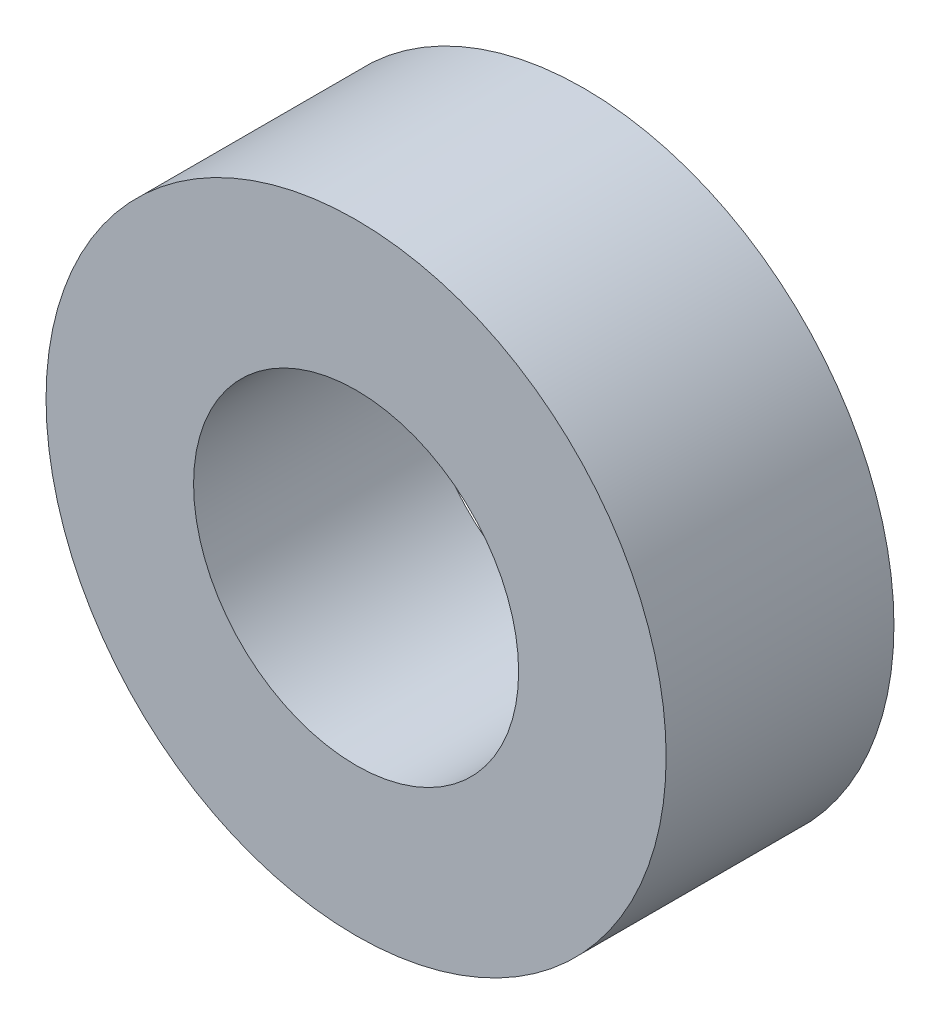
ISO-10303-21;
HEADER;
FILE_DESCRIPTION(('STEP AP214'),'2;1');
FILE_NAME('part.step','',(''),(''),'','','');
FILE_SCHEMA(('AUTOMOTIVE_DESIGN { 1 0 10303 214 1 1 1 1 }'));
ENDSEC;
DATA;
#1=APPLICATION_CONTEXT('core data for automotive mechanical design processes');
#2=APPLICATION_PROTOCOL_DEFINITION('international standard','automotive_design',2000,#1);
#3=PRODUCT_CONTEXT('',#1,'mechanical');
#4=PRODUCT('Part','Part','',(#3));
#5=PRODUCT_RELATED_PRODUCT_CATEGORY('part','',(#4));
#6=PRODUCT_DEFINITION_FORMATION('','',#4);
#7=PRODUCT_DEFINITION_CONTEXT('part definition',#1,'design');
#8=PRODUCT_DEFINITION('design','',#6,#7);
#9=PRODUCT_DEFINITION_SHAPE('','',#8);
#10=(LENGTH_UNIT() NAMED_UNIT(*) SI_UNIT(.MILLI.,.METRE.));
#11=(NAMED_UNIT(*) PLANE_ANGLE_UNIT() SI_UNIT($,.RADIAN.));
#12=(NAMED_UNIT(*) SI_UNIT($,.STERADIAN.) SOLID_ANGLE_UNIT());
#13=UNCERTAINTY_MEASURE_WITH_UNIT(LENGTH_MEASURE(1.E-05),#10,'distance_accuracy_value','');
#14=(GEOMETRIC_REPRESENTATION_CONTEXT(3) GLOBAL_UNCERTAINTY_ASSIGNED_CONTEXT((#13)) GLOBAL_UNIT_ASSIGNED_CONTEXT((#10,
#11,#12)) REPRESENTATION_CONTEXT('',''));
#15=CARTESIAN_POINT('',(0.,0.,0.));
#16=DIRECTION('',(0.,0.,1.));
#17=DIRECTION('',(1.,0.,0.));
#18=AXIS2_PLACEMENT_3D('',#15,#16,#17);
#19=CARTESIAN_POINT('',(0.,0.,11.1252));
#20=DIRECTION('',(0.,0.,-1.));
#21=DIRECTION('',(-1.,0.,0.));
#22=AXIS2_PLACEMENT_3D('',#19,#20,#21);
#23=CYLINDRICAL_SURFACE('',#22,15.142307663);
#24=CARTESIAN_POINT('',(0.,0.,11.1252));
#25=DIRECTION('',(0.,0.,1.));
#26=DIRECTION('',(1.,0.,0.));
#27=AXIS2_PLACEMENT_3D('',#24,#25,#26);
#28=CIRCLE('',#27,15.142307663);
#29=CARTESIAN_POINT('',(-15.142307663,0.,11.1252));
#30=VERTEX_POINT('',#29);
#31=EDGE_CURVE('E10',#30,#30,#28,.T.);
#32=CARTESIAN_POINT('',(0.,0.,0.));
#33=DIRECTION('',(0.,0.,1.));
#34=DIRECTION('',(1.,0.,0.));
#35=AXIS2_PLACEMENT_3D('',#32,#33,#34);
#36=CIRCLE('',#35,15.142307663);
#37=CARTESIAN_POINT('',(-15.142307663,0.,0.));
#38=VERTEX_POINT('',#37);
#39=EDGE_CURVE('E42',#38,#38,#36,.T.);
#40=CARTESIAN_POINT('',(-15.142307663,0.,11.1252));
#41=CARTESIAN_POINT('',(-15.142307663,0.,11.0093125));
#42=CARTESIAN_POINT('',(-15.142307663,0.,10.893425));
#43=CARTESIAN_POINT('',(-15.142307663,0.,10.66165));
#44=CARTESIAN_POINT('',(-15.142307663,0.,10.5457625));
#45=CARTESIAN_POINT('',(-15.142307663,0.,10.3139875));
#46=CARTESIAN_POINT('',(-15.142307663,0.,10.1981));
#47=CARTESIAN_POINT('',(-15.142307663,0.,9.966325));
#48=CARTESIAN_POINT('',(-15.142307663,0.,9.8504375));
#49=CARTESIAN_POINT('',(-15.142307663,0.,9.6186625));
#50=CARTESIAN_POINT('',(-15.142307663,0.,9.502775));
#51=CARTESIAN_POINT('',(-15.142307663,0.,9.271));
#52=CARTESIAN_POINT('',(-15.142307663,0.,9.1551125));
#53=CARTESIAN_POINT('',(-15.142307663,0.,8.9233375));
#54=CARTESIAN_POINT('',(-15.142307663,0.,8.80745));
#55=CARTESIAN_POINT('',(-15.142307663,0.,8.575675));
#56=CARTESIAN_POINT('',(-15.142307663,0.,8.4597875));
#57=CARTESIAN_POINT('',(-15.142307663,0.,8.2280125));
#58=CARTESIAN_POINT('',(-15.142307663,0.,8.112125));
#59=CARTESIAN_POINT('',(-15.142307663,0.,7.88035));
#60=CARTESIAN_POINT('',(-15.142307663,0.,7.7644625));
#61=CARTESIAN_POINT('',(-15.142307663,0.,7.5326875));
#62=CARTESIAN_POINT('',(-15.142307663,0.,7.4168));
#63=CARTESIAN_POINT('',(-15.142307663,0.,7.185025));
#64=CARTESIAN_POINT('',(-15.142307663,0.,7.0691375));
#65=CARTESIAN_POINT('',(-15.142307663,0.,6.8373625));
#66=CARTESIAN_POINT('',(-15.142307663,0.,6.721475));
#67=CARTESIAN_POINT('',(-15.142307663,0.,6.4897));
#68=CARTESIAN_POINT('',(-15.142307663,0.,6.3738125));
#69=CARTESIAN_POINT('',(-15.142307663,0.,6.1420375));
#70=CARTESIAN_POINT('',(-15.142307663,0.,6.02615));
#71=CARTESIAN_POINT('',(-15.142307663,0.,5.794375));
#72=CARTESIAN_POINT('',(-15.142307663,0.,5.6784875));
#73=CARTESIAN_POINT('',(-15.142307663,0.,5.4467125));
#74=CARTESIAN_POINT('',(-15.142307663,0.,5.330825));
#75=CARTESIAN_POINT('',(-15.142307663,0.,5.09905));
#76=CARTESIAN_POINT('',(-15.142307663,0.,4.9831625));
#77=CARTESIAN_POINT('',(-15.142307663,0.,4.7513875));
#78=CARTESIAN_POINT('',(-15.142307663,0.,4.6355));
#79=CARTESIAN_POINT('',(-15.142307663,0.,4.403725));
#80=CARTESIAN_POINT('',(-15.142307663,0.,4.2878375));
#81=CARTESIAN_POINT('',(-15.142307663,0.,4.0560625));
#82=CARTESIAN_POINT('',(-15.142307663,0.,3.940175));
#83=CARTESIAN_POINT('',(-15.142307663,0.,3.7084));
#84=CARTESIAN_POINT('',(-15.142307663,0.,3.5925125));
#85=CARTESIAN_POINT('',(-15.142307663,0.,3.3607375));
#86=CARTESIAN_POINT('',(-15.142307663,0.,3.24485));
#87=CARTESIAN_POINT('',(-15.142307663,0.,3.013075));
#88=CARTESIAN_POINT('',(-15.142307663,0.,2.8971875));
#89=CARTESIAN_POINT('',(-15.142307663,0.,2.6654125));
#90=CARTESIAN_POINT('',(-15.142307663,0.,2.549525));
#91=CARTESIAN_POINT('',(-15.142307663,0.,2.31775));
#92=CARTESIAN_POINT('',(-15.142307663,0.,2.2018625));
#93=CARTESIAN_POINT('',(-15.142307663,0.,1.9700875));
#94=CARTESIAN_POINT('',(-15.142307663,0.,1.8542));
#95=CARTESIAN_POINT('',(-15.142307663,0.,1.622425));
#96=CARTESIAN_POINT('',(-15.142307663,0.,1.5065375));
#97=CARTESIAN_POINT('',(-15.142307663,0.,1.2747625));
#98=CARTESIAN_POINT('',(-15.142307663,0.,1.158875));
#99=CARTESIAN_POINT('',(-15.142307663,0.,0.9271));
#100=CARTESIAN_POINT('',(-15.142307663,0.,0.8112125));
#101=CARTESIAN_POINT('',(-15.142307663,0.,0.5794375));
#102=CARTESIAN_POINT('',(-15.142307663,0.,0.46355));
#103=CARTESIAN_POINT('',(-15.142307663,0.,0.231775));
#104=CARTESIAN_POINT('',(-15.142307663,0.,0.1158875));
#105=CARTESIAN_POINT('',(-15.142307663,0.,0.));
#106=B_SPLINE_CURVE_WITH_KNOTS('',3,(#40,#41,#42,#43,#44,#45,#46,#47,#48,#49,#50,#51,#52,#53,
#54,#55,#56,#57,#58,#59,#60,#61,#62,#63,#64,#65,#66,#67,#68,#69,#70,#71,#72,#73,#74,#75,#76,#77,
#78,#79,#80,#81,#82,#83,#84,#85,#86,#87,#88,#89,#90,#91,#92,#93,#94,#95,#96,#97,#98,#99,#100,
#101,#102,#103,#104,#105),.UNSPECIFIED.,.F.,.F.,(4,2,2,2,2,2,2,2,2,2,2,2,2,2,2,2,2,2,2,2,2,2,2,
2,2,2,2,2,2,2,2,2,4),(0.,0.347662499999998,0.695324999999998,1.0429875,1.39065,1.7383125,
2.085975,2.4336375,2.7813,3.1289625,3.476625,3.8242875,4.17195,4.5196125,4.867275,5.2149375,
5.5626,5.9102625,6.257925,6.6055875,6.95325,7.3009125,7.648575,7.9962375,8.3439,8.6915625,
9.039225,9.3868875,9.73455,10.0822125,10.429875,10.7775375,11.1252),.UNSPECIFIED.);
#107=EDGE_CURVE('BSEAM39',#30,#38,#106,.T.);
#108=ORIENTED_EDGE('',*,*,#31,.F.);
#109=ORIENTED_EDGE('',*,*,#39,.T.);
#110=ORIENTED_EDGE('',*,*,#107,.T.);
#111=ORIENTED_EDGE('',*,*,#107,.F.);
#112=EDGE_LOOP('',(#108,#110,#109,#111));
#113=FACE_BOUND('',#112,.T.);
#114=ADVANCED_FACE('F39',(#113),#23,.T.);
#115=CARTESIAN_POINT('',(0.,0.,11.1252));
#116=DIRECTION('',(0.,0.,1.));
#117=DIRECTION('',(1.,0.,0.));
#118=AXIS2_PLACEMENT_3D('',#115,#116,#117);
#119=PLANE('',#118);
#120=CARTESIAN_POINT('',(0.,0.,11.1252));
#121=DIRECTION('',(0.,0.,1.));
#122=DIRECTION('',(1.,0.,0.));
#123=AXIS2_PLACEMENT_3D('',#120,#121,#122);
#124=CIRCLE('',#123,7.9375);
#125=CARTESIAN_POINT('',(7.9375,0.,11.1252));
#126=VERTEX_POINT('',#125);
#127=EDGE_CURVE('E49',#126,#126,#124,.F.);
#128=ORIENTED_EDGE('',*,*,#127,.T.);
#129=EDGE_LOOP('',(#128));
#130=FACE_BOUND('',#129,.T.);
#131=ORIENTED_EDGE('',*,*,#31,.T.);
#132=EDGE_LOOP('',(#131));
#133=FACE_BOUND('',#132,.T.);
#134=ADVANCED_FACE('F63',(#130,#133),#119,.T.);
#135=CARTESIAN_POINT('',(0.,0.,0.));
#136=DIRECTION('',(0.,0.,1.));
#137=DIRECTION('',(1.,0.,0.));
#138=AXIS2_PLACEMENT_3D('',#135,#136,#137);
#139=PLANE('',#138);
#140=CARTESIAN_POINT('',(0.,0.,0.));
#141=DIRECTION('',(0.,0.,-1.));
#142=DIRECTION('',(-1.,0.,0.));
#143=AXIS2_PLACEMENT_3D('',#140,#141,#142);
#144=CIRCLE('',#143,7.9375);
#145=CARTESIAN_POINT('',(-7.9375,0.,0.));
#146=VERTEX_POINT('',#145);
#147=EDGE_CURVE('E53',#146,#146,#144,.T.);
#148=ORIENTED_EDGE('',*,*,#147,.F.);
#149=EDGE_LOOP('',(#148));
#150=FACE_BOUND('',#149,.T.);
#151=ORIENTED_EDGE('',*,*,#39,.F.);
#152=EDGE_LOOP('',(#151));
#153=FACE_BOUND('',#152,.T.);
#154=ADVANCED_FACE('F60',(#150,#153),#139,.F.);
#155=CARTESIAN_POINT('',(0.,0.,33.5758403026729));
#156=DIRECTION('',(0.,0.,-1.));
#157=DIRECTION('',(-1.,0.,0.));
#158=AXIS2_PLACEMENT_3D('',#155,#156,#157);
#159=CYLINDRICAL_SURFACE('',#158,7.9375);
#160=ORIENTED_EDGE('',*,*,#147,.T.);
#161=EDGE_LOOP('',(#160));
#162=FACE_BOUND('',#161,.T.);
#163=ORIENTED_EDGE('',*,*,#127,.F.);
#164=EDGE_LOOP('',(#163));
#165=FACE_BOUND('',#164,.T.);
#166=ADVANCED_FACE('F57',(#162,#165),#159,.F.);
#167=CLOSED_SHELL('',(#114,#134,#154,#166));
#168=MANIFOLD_SOLID_BREP('B2',#167);
#169=ADVANCED_BREP_SHAPE_REPRESENTATION('',(#18,#168),#14);
#170=SHAPE_DEFINITION_REPRESENTATION(#9,#169);
ENDSEC;
END-ISO-10303-21;
